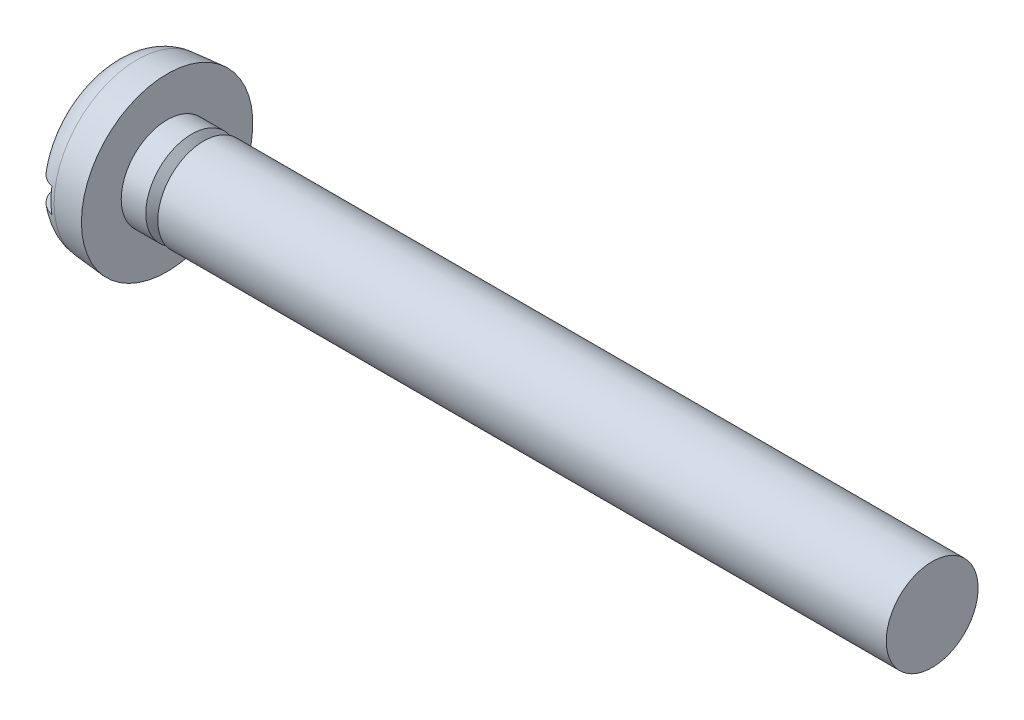
ISO-10303-21;
HEADER;
FILE_DESCRIPTION(('STEP AP214'),'2;1');
FILE_NAME('part.step','',(''),(''),'','','');
FILE_SCHEMA(('AUTOMOTIVE_DESIGN { 1 0 10303 214 1 1 1 1 }'));
ENDSEC;
DATA;
#1=APPLICATION_CONTEXT('core data for automotive mechanical design processes');
#2=APPLICATION_PROTOCOL_DEFINITION('international standard','automotive_design',2000,#1);
#3=PRODUCT_CONTEXT('',#1,'mechanical');
#4=PRODUCT('Part','Part','',(#3));
#5=PRODUCT_RELATED_PRODUCT_CATEGORY('part','',(#4));
#6=PRODUCT_DEFINITION_FORMATION('','',#4);
#7=PRODUCT_DEFINITION_CONTEXT('part definition',#1,'design');
#8=PRODUCT_DEFINITION('design','',#6,#7);
#9=PRODUCT_DEFINITION_SHAPE('','',#8);
#10=(LENGTH_UNIT() NAMED_UNIT(*) SI_UNIT(.MILLI.,.METRE.));
#11=(NAMED_UNIT(*) PLANE_ANGLE_UNIT() SI_UNIT($,.RADIAN.));
#12=(NAMED_UNIT(*) SI_UNIT($,.STERADIAN.) SOLID_ANGLE_UNIT());
#13=UNCERTAINTY_MEASURE_WITH_UNIT(LENGTH_MEASURE(1.E-05),#10,'distance_accuracy_value','');
#14=(GEOMETRIC_REPRESENTATION_CONTEXT(3) GLOBAL_UNCERTAINTY_ASSIGNED_CONTEXT((#13)) GLOBAL_UNIT_ASSIGNED_CONTEXT((#10,
#11,#12)) REPRESENTATION_CONTEXT('',''));
#15=CARTESIAN_POINT('',(0.,0.,0.));
#16=DIRECTION('',(0.,0.,1.));
#17=DIRECTION('',(1.,0.,0.));
#18=AXIS2_PLACEMENT_3D('',#15,#16,#17);
#19=CARTESIAN_POINT('',(0.,0.,0.));
#20=DIRECTION('',(-1.,0.,0.));
#21=DIRECTION('',(0.,0.,1.));
#22=AXIS2_PLACEMENT_3D('',#19,#20,#21);
#23=PLANE('',#22);
#24=DIRECTION('',(0.,0.,-1.));
#25=VECTOR('',#24,1.);
#26=CARTESIAN_POINT('',(0.,0.399999999999999,2.8));
#27=LINE('',#26,#25);
#28=CARTESIAN_POINT('',(0.,0.399999999999999,1.77326763142532));
#29=VERTEX_POINT('',#28);
#30=CARTESIAN_POINT('',(0.,0.399999999999999,-1.77326763142532));
#31=VERTEX_POINT('',#30);
#32=EDGE_CURVE('E85',#29,#31,#27,.T.);
#33=ORIENTED_EDGE('',*,*,#32,.F.);
#34=CARTESIAN_POINT('',(0.,0.,0.));
#35=DIRECTION('',(-1.,0.,0.));
#36=DIRECTION('',(0.,0.,1.));
#37=AXIS2_PLACEMENT_3D('',#34,#35,#36);
#38=CIRCLE('',#37,1.81782234903766);
#39=EDGE_CURVE('E91',#29,#31,#38,.T.);
#40=ORIENTED_EDGE('',*,*,#39,.T.);
#41=EDGE_LOOP('',(#33,#40));
#42=FACE_BOUND('',#41,.T.);
#43=ADVANCED_FACE('F32',(#42),#23,.T.);
#44=CARTESIAN_POINT('',(-25.4,0.,0.));
#45=DIRECTION('',(-1.,0.,0.));
#46=DIRECTION('',(0.,0.,1.));
#47=AXIS2_PLACEMENT_3D('',#44,#45,#46);
#48=CYLINDRICAL_SURFACE('',#47,1.5);
#49=CARTESIAN_POINT('',(2.60359178553217,0.,0.));
#50=DIRECTION('',(-1.,0.,0.));
#51=DIRECTION('',(0.,-1.,0.));
#52=AXIS2_PLACEMENT_3D('',#49,#50,#51);
#53=CIRCLE('',#52,1.5);
#54=CARTESIAN_POINT('',(2.60359178553217,-1.5,0.));
#55=VERTEX_POINT('',#54);
#56=EDGE_CURVE('E163',#55,#55,#53,.T.);
#57=ORIENTED_EDGE('',*,*,#56,.T.);
#58=EDGE_LOOP('',(#57));
#59=FACE_BOUND('',#58,.T.);
#60=CARTESIAN_POINT('',(1.8,0.,0.));
#61=DIRECTION('',(-1.,0.,0.));
#62=DIRECTION('',(0.,0.,1.));
#63=AXIS2_PLACEMENT_3D('',#60,#61,#62);
#64=CIRCLE('',#63,1.5);
#65=CARTESIAN_POINT('',(1.8,0.,1.5));
#66=VERTEX_POINT('',#65);
#67=EDGE_CURVE('E171',#66,#66,#64,.T.);
#68=ORIENTED_EDGE('',*,*,#67,.F.);
#69=EDGE_LOOP('',(#68));
#70=FACE_BOUND('',#69,.T.);
#71=ADVANCED_FACE('F136',(#59,#70),#48,.T.);
#72=DIRECTION('',(0.,0.,1.));
#73=VECTOR('',#72,1.);
#74=CARTESIAN_POINT('',(0.,-0.4,-2.8));
#75=LINE('',#74,#73);
#76=CARTESIAN_POINT('',(0.,-0.4,-1.77326763142532));
#77=VERTEX_POINT('',#76);
#78=CARTESIAN_POINT('',(0.,-0.4,1.77326763142532));
#79=VERTEX_POINT('',#78);
#80=EDGE_CURVE('E76',#77,#79,#75,.T.);
#81=ORIENTED_EDGE('',*,*,#80,.F.);
#82=EDGE_CURVE('E83',#77,#79,#38,.T.);
#83=ORIENTED_EDGE('',*,*,#82,.T.);
#84=EDGE_LOOP('',(#81,#83));
#85=FACE_BOUND('',#84,.T.);
#86=ADVANCED_FACE('F82',(#85),#23,.T.);
#87=CARTESIAN_POINT('',(0.,0.,0.));
#88=DIRECTION('',(1.,0.,0.));
#89=DIRECTION('',(0.,0.,-1.));
#90=AXIS2_PLACEMENT_3D('',#87,#88,#89);
#91=CONICAL_SURFACE('',#90,2.64252040565334,0.087266462599717);
#92=CARTESIAN_POINT('',(0.821559831527107,0.,0.));
#93=DIRECTION('',(-1.,0.,0.));
#94=DIRECTION('',(0.,0.,1.));
#95=AXIS2_PLACEMENT_3D('',#92,#93,#94);
#96=CIRCLE('',#95,2.71439757732023);
#97=CARTESIAN_POINT('',(0.821559831527107,0.,2.71439757732023));
#98=VERTEX_POINT('',#97);
#99=EDGE_CURVE('E95',#98,#98,#96,.F.);
#100=ORIENTED_EDGE('',*,*,#99,.T.);
#101=EDGE_LOOP('',(#100));
#102=FACE_BOUND('',#101,.T.);
#103=CARTESIAN_POINT('',(1.8,0.,0.));
#104=DIRECTION('',(-1.,0.,0.));
#105=DIRECTION('',(0.,0.,1.));
#106=AXIS2_PLACEMENT_3D('',#103,#104,#105);
#107=CIRCLE('',#106,2.8);
#108=CARTESIAN_POINT('',(1.8,0.,2.8));
#109=VERTEX_POINT('',#108);
#110=EDGE_CURVE('E97',#109,#109,#107,.T.);
#111=ORIENTED_EDGE('',*,*,#110,.T.);
#112=EDGE_LOOP('',(#111));
#113=FACE_BOUND('',#112,.T.);
#114=ADVANCED_FACE('F129',(#102,#113),#91,.T.);
#115=CARTESIAN_POINT('',(1.8,1.5,0.));
#116=DIRECTION('',(-1.,0.,0.));
#117=DIRECTION('',(0.,0.,1.));
#118=AXIS2_PLACEMENT_3D('',#115,#116,#117);
#119=PLANE('',#118);
#120=ORIENTED_EDGE('',*,*,#110,.F.);
#121=EDGE_LOOP('',(#120));
#122=FACE_BOUND('',#121,.T.);
#123=ORIENTED_EDGE('',*,*,#67,.T.);
#124=EDGE_LOOP('',(#123));
#125=FACE_BOUND('',#124,.T.);
#126=ADVANCED_FACE('F125',(#122,#125),#119,.F.);
#127=CARTESIAN_POINT('',(0.9,0.,0.));
#128=DIRECTION('',(-1.,0.,0.));
#129=DIRECTION('',(0.,0.,1.));
#130=AXIS2_PLACEMENT_3D('',#127,#128,#129);
#131=TOROIDAL_SURFACE('',#130,1.81782234903766,0.9);
#132=CARTESIAN_POINT('',(0.285780762477817,0.399999999999999,-2.44311963508101));
#133=CARTESIAN_POINT('',(0.322325244969282,0.399999999999999,-2.47769297217772));
#134=CARTESIAN_POINT('',(0.361794878156767,0.399999999999999,-2.50922544126929));
#135=CARTESIAN_POINT('',(0.445493757535042,0.399999999999999,-2.56525291577746));
#136=CARTESIAN_POINT('',(0.48972822484029,0.399999999999999,-2.58974009118149));
#137=CARTESIAN_POINT('',(0.581685294636184,0.399999999999999,-2.63091846199156));
#138=CARTESIAN_POINT('',(0.629407305379897,0.399999999999999,-2.64761097641683));
#139=CARTESIAN_POINT('',(0.726972312257168,0.399999999999999,-2.67270033258514));
#140=CARTESIAN_POINT('',(0.776814803129367,0.399999999999999,-2.68109913910669));
#141=CARTESIAN_POINT('',(0.876977038697278,0.399999999999999,-2.68933922206438));
#142=CARTESIAN_POINT('',(0.92729364560996,0.399999999999999,-2.68921866149007));
#143=CARTESIAN_POINT('',(1.02719093347253,0.399999999999999,-2.68051830929739));
#144=CARTESIAN_POINT('',(1.07677160162593,0.399999999999999,-2.67193837076201));
#145=CARTESIAN_POINT('',(1.17371760664879,0.399999999999999,-2.6465919807109));
#146=CARTESIAN_POINT('',(1.2210859954371,0.399999999999999,-2.62983719558013));
#147=CARTESIAN_POINT('',(1.31235127069059,0.399999999999999,-2.58864040768255));
#148=CARTESIAN_POINT('',(1.35624813968071,0.399999999999999,-2.56419836622246));
#149=CARTESIAN_POINT('',(1.43950339303332,0.399999999999999,-2.50824069345436));
#150=CARTESIAN_POINT('',(1.47884484993389,0.399999999999999,-2.47669988555644));
#151=CARTESIAN_POINT('',(1.55173067508121,0.399999999999999,-2.40751412200212));
#152=CARTESIAN_POINT('',(1.5852748745774,0.399999999999999,-2.36986898871862));
#153=CARTESIAN_POINT('',(1.64594872274809,0.399999999999999,-2.28919528368316));
#154=CARTESIAN_POINT('',(1.67301846569636,0.399999999999999,-2.24612167422176));
#155=CARTESIAN_POINT('',(1.71966197411636,0.399999999999999,-2.15609376898817));
#156=CARTESIAN_POINT('',(1.73923530584546,0.399999999999999,-2.10913924885738));
#157=CARTESIAN_POINT('',(1.77066025907209,0.399999999999999,-2.01194193646076));
#158=CARTESIAN_POINT('',(1.78239254664628,0.399999999999999,-1.96166058810882));
#159=CARTESIAN_POINT('',(1.7974373595853,0.399999999999999,-1.85985639013623));
#160=CARTESIAN_POINT('',(1.80074908437145,0.399999999999999,-1.80833342293966));
#161=CARTESIAN_POINT('',(1.79894832980293,0.399999999999999,-1.70434405475568));
#162=CARTESIAN_POINT('',(1.79365584590562,0.399999999999999,-1.651880798299));
#163=CARTESIAN_POINT('',(1.77456092354076,0.399999999999999,-1.54852841034414));
#164=CARTESIAN_POINT('',(1.76075741543224,0.399999999999999,-1.49763947754675));
#165=CARTESIAN_POINT('',(1.7246504916629,0.399999999999999,-1.3975266769579));
#166=CARTESIAN_POINT('',(1.70214283236717,0.399999999999999,-1.34837644263265));
#167=CARTESIAN_POINT('',(1.64933120824444,0.399999999999999,-1.25444995564252));
#168=CARTESIAN_POINT('',(1.6190255468442,0.399999999999999,-1.20967465773975));
#169=CARTESIAN_POINT('',(1.55085214424215,0.399999999999999,-1.12504927254803));
#170=CARTESIAN_POINT('',(1.51286662510254,0.399999999999999,-1.08529386793689));
#171=CARTESIAN_POINT('',(1.4306134165613,0.399999999999999,-1.01288372669285));
#172=CARTESIAN_POINT('',(1.38634513970435,0.399999999999999,-0.980229654778111));
#173=CARTESIAN_POINT('',(1.29378824575784,0.399999999999999,-0.924048107397016));
#174=CARTESIAN_POINT('',(1.24562231583718,0.399999999999999,-0.900319541839471));
#175=CARTESIAN_POINT('',(1.14574424072186,0.399999999999999,-0.862177327128566));
#176=CARTESIAN_POINT('',(1.09403573066562,0.399999999999999,-0.847754283110135));
#177=CARTESIAN_POINT('',(0.993395643106034,0.399999999999999,-0.830011922353259));
#178=CARTESIAN_POINT('',(0.944615271160062,0.399999999999999,-0.825833796085957));
#179=CARTESIAN_POINT('',(0.847107354416666,0.399999999999999,-0.826334878356685));
#180=CARTESIAN_POINT('',(0.798379798268946,0.399999999999999,-0.831011470142969));
#181=CARTESIAN_POINT('',(0.705495670608723,0.399999999999999,-0.848340731069384));
#182=CARTESIAN_POINT('',(0.661242330843084,0.399999999999999,-0.860484898174224));
#183=CARTESIAN_POINT('',(0.575232402842408,0.399999999999999,-0.891650416332973));
#184=CARTESIAN_POINT('',(0.53347652813922,0.399999999999999,-0.910673721938904));
#185=CARTESIAN_POINT('',(0.451191926076945,0.399999999999999,-0.956010770911779));
#186=CARTESIAN_POINT('',(0.410848958567061,0.399999999999999,-0.982660648611481));
#187=CARTESIAN_POINT('',(0.334722321142852,0.399999999999999,-1.04182188589593));
#188=CARTESIAN_POINT('',(0.298940164912518,0.399999999999999,-1.0743351828853));
#189=CARTESIAN_POINT('',(0.229649980616187,0.399999999999999,-1.14749226888793));
#190=CARTESIAN_POINT('',(0.19663491483028,0.399999999999999,-1.18860403936715));
#191=CARTESIAN_POINT('',(0.137645150810003,0.399999999999999,-1.27560624817727));
#192=CARTESIAN_POINT('',(0.111672172806046,0.399999999999999,-1.32149785033543));
#193=CARTESIAN_POINT('',(0.0665593590158845,0.399999999999999,-1.41881690272049));
#194=CARTESIAN_POINT('',(0.0477401615322295,0.399999999999999,-1.47039354331754));
#195=CARTESIAN_POINT('',(0.0191028447664949,0.399999999999999,-1.57598967955257));
#196=CARTESIAN_POINT('',(0.0092842991143383,0.399999999999999,-1.63000905934828));
#197=CARTESIAN_POINT('',(-0.000908845669418229,0.399999999999999,-1.73850050809585));
#198=CARTESIAN_POINT('',(-0.00135843890630432,0.399999999999999,-1.7929654882335));
#199=CARTESIAN_POINT('',(0.00713794868793661,0.399999999999999,-1.90117587148683));
#200=CARTESIAN_POINT('',(0.0160852351491477,0.399999999999999,-1.9549211735574));
#201=CARTESIAN_POINT('',(0.0428869469078851,0.399999999999999,-2.05874477252473));
#202=CARTESIAN_POINT('',(0.0605196216319729,0.399999999999999,-2.10888044427302));
#203=CARTESIAN_POINT('',(0.104140493725079,0.399999999999999,-2.20532358851202));
#204=CARTESIAN_POINT('',(0.130117020588857,0.399999999999999,-2.25163629510255));
#205=CARTESIAN_POINT('',(0.178150945787741,0.399999999999999,-2.32211375046635));
#206=CARTESIAN_POINT('',(0.197843641859489,0.399999999999999,-2.34792122195273));
#207=CARTESIAN_POINT('',(0.239879292580621,0.399999999999999,-2.39728022756983));
#208=CARTESIAN_POINT('',(0.26222221206527,0.399999999999999,-2.42083179162577));
#209=CARTESIAN_POINT('',(0.285780762477817,0.399999999999999,-2.44311963508101));
#210=B_SPLINE_CURVE_WITH_KNOTS('',3,(#132,#133,#134,#135,#136,#137,#138,#139,#140,#141,#142,
#143,#144,#145,#146,#147,#148,#149,#150,#151,#152,#153,#154,#155,#156,#157,#158,#159,#160,#161,
#162,#163,#164,#165,#166,#167,#168,#169,#170,#171,#172,#173,#174,#175,#176,#177,#178,#179,#180,
#181,#182,#183,#184,#185,#186,#187,#188,#189,#190,#191,#192,#193,#194,#195,#196,#197,#198,#199,
#200,#201,#202,#203,#204,#205,#206,#207,#208,#209),.UNSPECIFIED.,.T.,.F.,(4,2,2,2,2,2,2,2,2,2,2,
2,2,2,2,2,2,2,2,2,2,2,2,2,2,2,2,2,2,2,2,2,2,2,2,2,2,2,4),(0.,0.15080428220943,0.301775523831159,
0.452721208703323,0.603631125974155,0.753865076726384,0.904101636690626,1.05412441728995,
1.2041479530309,1.35471219197995,1.50528081291863,1.65719291262943,1.80911380065295,
1.96329712022902,2.11749509812026,2.27496068670365,2.43244606914274,2.59387611122166,
2.75534130458713,2.9195015653164,3.08367718561128,3.24389389244898,3.40394859014677,
3.55004213794101,3.69609251881818,3.83315592967566,3.97025831464733,4.11470991133513,
4.25920932580005,4.41668805635775,4.57420522099047,4.73812462607052,4.90203626571949,
5.06463536051201,5.22725705028985,5.38592661841767,5.54437521558828,5.64159310397338,
5.73880970255809),.UNSPECIFIED.);
#211=CARTESIAN_POINT('',(0.7,0.399999999999999,-2.66547244738019));
#212=VERTEX_POINT('',#211);
#213=EDGE_CURVE('E11',#31,#212,#210,.T.);
#214=ORIENTED_EDGE('',*,*,#213,.F.);
#215=ORIENTED_EDGE('',*,*,#39,.F.);
#216=CARTESIAN_POINT('',(0.356169071138296,0.399999999999999,1.02545886384317));
#217=CARTESIAN_POINT('',(0.394477383289829,0.399999999999999,0.994276095963573));
#218=CARTESIAN_POINT('',(0.435252098816795,0.399999999999999,0.966090537778846));
#219=CARTESIAN_POINT('',(0.520874070068605,0.399999999999999,0.916713010685472));
#220=CARTESIAN_POINT('',(0.56572297498939,0.399999999999999,0.895523890103122));
#221=CARTESIAN_POINT('',(0.658585145836014,0.399999999999999,0.861072215462475));
#222=CARTESIAN_POINT('',(0.706609437889925,0.399999999999999,0.84783908573147));
#223=CARTESIAN_POINT('',(0.80424325350734,0.399999999999999,0.83024223356215));
#224=CARTESIAN_POINT('',(0.853851628876229,0.399999999999999,0.825872228699233));
#225=CARTESIAN_POINT('',(0.950010182321422,0.399999999999999,0.826277197704913));
#226=CARTESIAN_POINT('',(0.99656347412262,0.399999999999999,0.830513937244102));
#227=CARTESIAN_POINT('',(1.08828168676608,0.399999999999999,0.846797595491545));
#228=CARTESIAN_POINT('',(1.1334463088223,0.399999999999999,0.858846182848628));
#229=CARTESIAN_POINT('',(1.22099947575276,0.399999999999999,0.890027753500388));
#230=CARTESIAN_POINT('',(1.26339999097867,0.399999999999999,0.909127417221132));
#231=CARTESIAN_POINT('',(1.34475562295769,0.399999999999999,0.953613660794996));
#232=CARTESIAN_POINT('',(1.38370973618203,0.399999999999999,0.979002063689565));
#233=CARTESIAN_POINT('',(1.4606297229717,0.399999999999999,1.03768873851847));
#234=CARTESIAN_POINT('',(1.49821861120609,0.399999999999999,1.07148126912978));
#235=CARTESIAN_POINT('',(1.56766557552966,0.399999999999999,1.14451739265722));
#236=CARTESIAN_POINT('',(1.59952174981566,0.399999999999999,1.18376278691406));
#237=CARTESIAN_POINT('',(1.65882951195037,0.399999999999999,1.26965174466254));
#238=CARTESIAN_POINT('',(1.68580874421987,0.399999999999999,1.3166225459502));
#239=CARTESIAN_POINT('',(1.7316261790846,0.399999999999999,1.41438438512647));
#240=CARTESIAN_POINT('',(1.7504634598458,0.399999999999999,1.46517585482832));
#241=CARTESIAN_POINT('',(1.77959171793735,0.399999999999999,1.56990546726));
#242=CARTESIAN_POINT('',(1.78976336496765,0.399999999999999,1.62387693551388));
#243=CARTESIAN_POINT('',(1.80070617985939,0.399999999999999,1.73276786407042));
#244=CARTESIAN_POINT('',(1.80147810121521,0.399999999999999,1.78768724803349));
#245=CARTESIAN_POINT('',(1.7935515731225,0.399999999999999,1.89576039323533));
#246=CARTESIAN_POINT('',(1.78503812714098,0.399999999999999,1.94892767588158));
#247=CARTESIAN_POINT('',(1.75897009134329,0.399999999999999,2.05299963181349));
#248=CARTESIAN_POINT('',(1.74141670948687,0.399999999999999,2.10390460641263));
#249=CARTESIAN_POINT('',(1.69825810143573,0.399999999999999,2.20064023444731));
#250=CARTESIAN_POINT('',(1.67286703477487,0.399999999999999,2.24656646381803));
#251=CARTESIAN_POINT('',(1.61458416704904,0.399999999999999,2.33338474929434));
#252=CARTESIAN_POINT('',(1.58169323312494,0.399999999999999,2.37427738654701));
#253=CARTESIAN_POINT('',(1.51007060998367,0.399999999999999,2.44900649357427));
#254=CARTESIAN_POINT('',(1.47146964140907,0.399999999999999,2.48296829636122));
#255=CARTESIAN_POINT('',(1.38904817001727,0.399999999999999,2.54382334084698));
#256=CARTESIAN_POINT('',(1.34522808158393,0.399999999999999,2.57071714318276));
#257=CARTESIAN_POINT('',(1.25424836231413,0.399999999999999,2.61630908807752));
#258=CARTESIAN_POINT('',(1.20714119293126,0.399999999999999,2.63511196373395));
#259=CARTESIAN_POINT('',(1.11042474691739,0.399999999999999,2.66447616047847));
#260=CARTESIAN_POINT('',(1.06081558875378,0.399999999999999,2.67503787139057));
#261=CARTESIAN_POINT('',(0.960893961973373,0.399999999999999,2.68755622717405));
#262=CARTESIAN_POINT('',(0.910589316471373,0.399999999999999,2.68957539390776));
#263=CARTESIAN_POINT('',(0.810358152757913,0.399999999999999,2.68512046084422));
#264=CARTESIAN_POINT('',(0.760431626986743,0.399999999999999,2.67864653130185));
#265=CARTESIAN_POINT('',(0.662478823238217,0.399999999999999,2.65741995217084));
#266=CARTESIAN_POINT('',(0.614448868329621,0.399999999999999,2.64268425826029));
#267=CARTESIAN_POINT('',(0.521534433162197,0.399999999999999,2.60538142887937));
#268=CARTESIAN_POINT('',(0.476649962619439,0.399999999999999,2.58281426921971));
#269=CARTESIAN_POINT('',(0.391148993047609,0.399999999999999,2.53043182461717));
#270=CARTESIAN_POINT('',(0.350545548527357,0.399999999999999,2.50059523892845));
#271=CARTESIAN_POINT('',(0.27487411765014,0.399999999999999,2.43457977439371));
#272=CARTESIAN_POINT('',(0.239806285839746,0.399999999999999,2.39840071853429));
#273=CARTESIAN_POINT('',(0.1758792791862,0.399999999999999,2.32042102737606));
#274=CARTESIAN_POINT('',(0.147073507775005,0.399999999999999,2.27857662814835));
#275=CARTESIAN_POINT('',(0.0967847753411475,0.399999999999999,2.19069995841567));
#276=CARTESIAN_POINT('',(0.07530224160311,0.399999999999999,2.14466744374764));
#277=CARTESIAN_POINT('',(0.0399276675747797,0.399999999999999,2.04903409979779));
#278=CARTESIAN_POINT('',(0.0261471165350435,0.399999999999999,1.99939205575588));
#279=CARTESIAN_POINT('',(0.00693602242391587,0.399999999999999,1.89852251200784));
#280=CARTESIAN_POINT('',(0.00150590448368245,0.399999999999999,1.84729493171548));
#281=CARTESIAN_POINT('',(-0.000985777473936844,0.399999999999999,1.74359522844075));
#282=CARTESIAN_POINT('',(0.00212519999965288,0.399999999999999,1.69111899279254));
#283=CARTESIAN_POINT('',(0.0168916821616579,0.399999999999999,1.58737297380086));
#284=CARTESIAN_POINT('',(0.0285499964789277,0.399999999999999,1.53610359288829));
#285=CARTESIAN_POINT('',(0.0604020950384819,0.399999999999999,1.43486374575567));
#286=CARTESIAN_POINT('',(0.080804315905155,0.399999999999999,1.38495893538538));
#287=CARTESIAN_POINT('',(0.129530825890043,0.399999999999999,1.28921347783136));
#288=CARTESIAN_POINT('',(0.157849403934622,0.399999999999999,1.24336993202389));
#289=CARTESIAN_POINT('',(0.213684916145749,0.399999999999999,1.16773658539622));
#290=CARTESIAN_POINT('',(0.239651023875377,0.399999999999999,1.13678903007943));
#291=CARTESIAN_POINT('',(0.29525297901351,0.399999999999999,1.07838116842152));
#292=CARTESIAN_POINT('',(0.324888803246328,0.399999999999999,1.05092084005941));
#293=CARTESIAN_POINT('',(0.356169071138296,0.399999999999999,1.02545886384317));
#294=B_SPLINE_CURVE_WITH_KNOTS('',3,(#216,#217,#218,#219,#220,#221,#222,#223,#224,#225,#226,
#227,#228,#229,#230,#231,#232,#233,#234,#235,#236,#237,#238,#239,#240,#241,#242,#243,#244,#245,
#246,#247,#248,#249,#250,#251,#252,#253,#254,#255,#256,#257,#258,#259,#260,#261,#262,#263,#264,
#265,#266,#267,#268,#269,#270,#271,#272,#273,#274,#275,#276,#277,#278,#279,#280,#281,#282,#283,
#284,#285,#286,#287,#288,#289,#290,#291,#292,#293),.UNSPECIFIED.,.T.,.F.,(4,2,2,2,2,2,2,2,2,2,2,
2,2,2,2,2,2,2,2,2,2,2,2,2,2,2,2,2,2,2,2,2,2,2,2,2,2,2,4),(0.,0.148056677712979,
0.296173556814866,0.444834912477076,0.593390856036848,0.732942639414739,0.87252424155987,
1.01145452751666,1.15042513517956,1.30141738715291,1.45245963818336,1.61420969223844,
1.7759780548859,1.93993961693164,2.10388803551639,2.26462860972824,2.42534771058163,
2.58201478455569,2.73866375372932,2.89216335268838,3.04565077231286,3.19708679229202,
3.34851564860216,3.49883427697698,3.64914989207022,3.79915813668078,3.94916684463061,
4.09962050651671,4.25007836811616,4.40177296660437,4.55347641441351,4.70732244078731,
4.86117629939849,5.0181609530014,5.17519723279955,5.33620557401864,5.49709805791682,
5.61799301592463,5.73888721047272),.UNSPECIFIED.);
#295=CARTESIAN_POINT('',(0.7,0.399999999999999,2.66547244738019));
#296=VERTEX_POINT('',#295);
#297=EDGE_CURVE('E109',#296,#29,#294,.T.);
#298=ORIENTED_EDGE('',*,*,#297,.F.);
#299=CARTESIAN_POINT('',(0.7,0.,0.));
#300=DIRECTION('',(-1.,0.,0.));
#301=DIRECTION('',(0.,0.,1.));
#302=AXIS2_PLACEMENT_3D('',#299,#300,#301);
#303=CIRCLE('',#302,2.69531878777687);
#304=CARTESIAN_POINT('',(0.7,-0.4,2.66547244738019));
#305=VERTEX_POINT('',#304);
#306=EDGE_CURVE('E103',#296,#305,#303,.F.);
#307=ORIENTED_EDGE('',*,*,#306,.T.);
#308=CARTESIAN_POINT('',(0.356169071138295,-0.4,1.02545886384317));
#309=CARTESIAN_POINT('',(0.314031332279046,-0.4,1.05976167261355));
#310=CARTESIAN_POINT('',(0.274819372687131,-0.4,1.0977427449374));
#311=CARTESIAN_POINT('',(0.20326819432942,-0.4,1.17978565669674));
#312=CARTESIAN_POINT('',(0.170942545508555,-0.4,1.22385922524595));
#313=CARTESIAN_POINT('',(0.114111407238762,-0.4,1.31672727393884));
#314=CARTESIAN_POINT('',(0.0895968760226379,-0.4,1.36551620987613));
#315=CARTESIAN_POINT('',(0.0490785202121342,-0.4,1.46648183341045));
#316=CARTESIAN_POINT('',(0.0330703604686471,-0.4,1.51865678013273));
#317=CARTESIAN_POINT('',(0.0100453697545739,-0.4,1.62518908376032));
#318=CARTESIAN_POINT('',(0.00306618218707072,-0.4,1.67955460937645));
#319=CARTESIAN_POINT('',(-0.00144685561490153,-0.4,1.78868546318226));
#320=CARTESIAN_POINT('',(0.00101939609011318,-0.4,1.84345079568049));
#321=CARTESIAN_POINT('',(0.0152891480749748,-0.4,1.95052330416009));
#322=CARTESIAN_POINT('',(0.0268854930795697,-0.4,2.0028580557661));
#323=CARTESIAN_POINT('',(0.0589248901673074,-0.4,2.10474672243029));
#324=CARTESIAN_POINT('',(0.0793666318053631,-0.4,2.15430104818042));
#325=CARTESIAN_POINT('',(0.12795627217374,-0.4,2.24792186385266));
#326=CARTESIAN_POINT('',(0.155901237504733,-0.4,2.29209371256844));
#327=CARTESIAN_POINT('',(0.218944857951456,-0.4,2.37499861286517));
#328=CARTESIAN_POINT('',(0.254042725445854,-0.4,2.41373226246544));
#329=CARTESIAN_POINT('',(0.32966685096813,-0.4,2.48389534278566));
#330=CARTESIAN_POINT('',(0.370077637452012,-0.4,2.51544927894014));
#331=CARTESIAN_POINT('',(0.455677448683675,-0.4,2.57122459505542));
#332=CARTESIAN_POINT('',(0.500866128165061,-0.4,2.59544650436481));
#333=CARTESIAN_POINT('',(0.59413782417454,-0.4,2.6355729416184));
#334=CARTESIAN_POINT('',(0.642178527071038,-0.4,2.65157587103637));
#335=CARTESIAN_POINT('',(0.740273420359947,-0.4,2.67523109383666));
#336=CARTESIAN_POINT('',(0.790327524333046,-0.4,2.68288374523438));
#337=CARTESIAN_POINT('',(0.890686133385994,-0.4,2.68958762962226));
#338=CARTESIAN_POINT('',(0.940986998851127,-0.4,2.68869347246838));
#339=CARTESIAN_POINT('',(1.04072178380744,-0.4,2.67846167879018));
#340=CARTESIAN_POINT('',(1.0901557170213,-0.4,2.66912417603886));
#341=CARTESIAN_POINT('',(1.18669599164727,-0.4,2.64229877559468));
#342=CARTESIAN_POINT('',(1.23380501833184,-0.4,2.6248205362643));
#343=CARTESIAN_POINT('',(1.32443528846507,-0.4,2.58223220159563));
#344=CARTESIAN_POINT('',(1.36795650500275,-0.4,2.5571220490195));
#345=CARTESIAN_POINT('',(1.45036421793263,-0.4,2.49989362614525));
#346=CARTESIAN_POINT('',(1.48923230512215,-0.4,2.46774885590998));
#347=CARTESIAN_POINT('',(1.56107927302393,-0.4,2.39744378923729));
#348=CARTESIAN_POINT('',(1.59405796507024,-0.4,2.35928330016087));
#349=CARTESIAN_POINT('',(1.65352847250663,-0.4,2.2776666814067));
#350=CARTESIAN_POINT('',(1.67995797143492,-0.4,2.23416516156708));
#351=CARTESIAN_POINT('',(1.72526137908633,-0.4,2.14339421504174));
#352=CARTESIAN_POINT('',(1.74413484906926,-0.4,2.09612456975119));
#353=CARTESIAN_POINT('',(1.77411508290512,-0.4,1.9983989612356));
#354=CARTESIAN_POINT('',(1.78509960932637,-0.4,1.9479055243096));
#355=CARTESIAN_POINT('',(1.79862667184961,-0.4,1.84580292273346));
#356=CARTESIAN_POINT('',(1.80116838107033,-0.4,1.79419364929756));
#357=CARTESIAN_POINT('',(1.79780993826834,-0.4,1.69014314952536));
#358=CARTESIAN_POINT('',(1.79172746900389,-0.4,1.63770783465182));
#359=CARTESIAN_POINT('',(1.77106806778027,-0.4,1.53454005861514));
#360=CARTESIAN_POINT('',(1.75649007103968,-0.4,1.48380781174802));
#361=CARTESIAN_POINT('',(1.7188487103298,-0.4,1.38413781596447));
#362=CARTESIAN_POINT('',(1.69558194660123,-0.4,1.33527684770509));
#363=CARTESIAN_POINT('',(1.64130257902653,-0.4,1.24205401456033));
#364=CARTESIAN_POINT('',(1.6102882125599,-0.4,1.19769317671197));
#365=CARTESIAN_POINT('',(1.54078360718032,-0.4,1.11407031283595));
#366=CARTESIAN_POINT('',(1.50218355419827,-0.4,1.07489936013486));
#367=CARTESIAN_POINT('',(1.418793823597,-0.4,1.00377929202409));
#368=CARTESIAN_POINT('',(1.37400377230517,-0.4,0.971830612909673));
#369=CARTESIAN_POINT('',(1.28066227969846,-0.4,0.917245549760186));
#370=CARTESIAN_POINT('',(1.23224470963451,-0.4,0.894381439836963));
#371=CARTESIAN_POINT('',(1.13202516716603,-0.4,0.858023892867301));
#372=CARTESIAN_POINT('',(1.08022692076976,-0.4,0.844520323748755));
#373=CARTESIAN_POINT('',(0.979686768939645,-0.4,0.828554710074538));
#374=CARTESIAN_POINT('',(0.93108358272059,-0.4,0.82521631591368));
#375=CARTESIAN_POINT('',(0.834057576527117,-0.4,0.827306267768066));
#376=CARTESIAN_POINT('',(0.785634764475607,-0.4,0.832734994430688));
#377=CARTESIAN_POINT('',(0.693219129123407,-0.4,0.851440182721389));
#378=CARTESIAN_POINT('',(0.6491307615266,-0.4,0.864254528165209));
#379=CARTESIAN_POINT('',(0.563580966367806,-0.4,0.896690334746237));
#380=CARTESIAN_POINT('',(0.522117110679347,-0.4,0.916305391888431));
#381=CARTESIAN_POINT('',(0.460201335026828,-0.4,0.951554535089635));
#382=CARTESIAN_POINT('',(0.438547037771903,-0.4,0.965129512636783));
#383=CARTESIAN_POINT('',(0.396436028831445,-0.4,0.994018383793285));
#384=CARTESIAN_POINT('',(0.375979221006585,-0.4,1.00933213751563));
#385=CARTESIAN_POINT('',(0.356169071138295,-0.4,1.02545886384317));
#386=B_SPLINE_CURVE_WITH_KNOTS('',3,(#308,#309,#310,#311,#312,#313,#314,#315,#316,#317,#318,
#319,#320,#321,#322,#323,#324,#325,#326,#327,#328,#329,#330,#331,#332,#333,#334,#335,#336,#337,
#338,#339,#340,#341,#342,#343,#344,#345,#346,#347,#348,#349,#350,#351,#352,#353,#354,#355,#356,
#357,#358,#359,#360,#361,#362,#363,#364,#365,#366,#367,#368,#369,#370,#371,#372,#373,#374,#375,
#376,#377,#378,#379,#380,#381,#382,#383,#384,#385),.UNSPECIFIED.,.T.,.F.,(4,2,2,2,2,2,2,2,2,2,2,
2,2,2,2,2,2,2,2,2,2,2,2,2,2,2,2,2,2,2,2,2,2,2,2,2,2,2,4),(0.,0.162908543977831,
0.326135200101453,0.489172220791498,0.652126072139756,0.815757140806174,0.979389975458609,
1.13941349616251,1.29941331750199,1.45545894016543,1.61148738958683,1.76455910424509,
1.91761976498379,2.068802492645,2.21997873814259,2.37018969158947,2.52039826519579,
2.67042907998157,2.82046101999671,2.97106818075077,3.12168016531919,3.27367450756494,
3.42567767407005,3.5799880622519,3.73431356299688,3.89195060675763,4.04960741210517,
4.2112132976058,4.37285598283535,4.53703863620331,4.70123120514445,4.86099956435944,
5.02059471531597,5.16597452097209,5.31136063884072,5.44850857150574,5.58552770590542,
5.66212180496716,5.73870974628516),.UNSPECIFIED.);
#387=EDGE_CURVE('E90',#79,#305,#386,.T.);
#388=ORIENTED_EDGE('',*,*,#387,.F.);
#389=ORIENTED_EDGE('',*,*,#82,.F.);
#390=CARTESIAN_POINT('',(0.285780762477817,-0.4,-2.44311963508101));
#391=CARTESIAN_POINT('',(0.248557143829483,-0.4,-2.4078972812164));
#392=CARTESIAN_POINT('',(0.214312452361191,-0.4,-2.3694650707352));
#393=CARTESIAN_POINT('',(0.152768043532584,-0.4,-2.28733938194963));
#394=CARTESIAN_POINT('',(0.125478130377416,-0.4,-2.24363860286105));
#395=CARTESIAN_POINT('',(0.0786257158649477,-0.4,-2.15234079857027));
#396=CARTESIAN_POINT('',(0.0590537929026405,-0.4,-2.10474861000723));
#397=CARTESIAN_POINT('',(0.0280650821156157,-0.4,-2.00700047851119));
#398=CARTESIAN_POINT('',(0.0166461813020744,-0.4,-1.95684520345737));
#399=CARTESIAN_POINT('',(0.00206923204411929,-0.4,-1.85464080389292));
#400=CARTESIAN_POINT('',(-0.000972085111053079,-0.4,-1.80257506295451));
#401=CARTESIAN_POINT('',(0.00151453147792944,-0.4,-1.69864852440772));
#402=CARTESIAN_POINT('',(0.00704382880236603,-0.4,-1.64678776072725));
#403=CARTESIAN_POINT('',(0.0266516864050343,-0.4,-1.5434240201059));
#404=CARTESIAN_POINT('',(0.0409314131746847,-0.4,-1.49195921679783));
#405=CARTESIAN_POINT('',(0.0777275151672631,-0.4,-1.39206285915813));
#406=CARTESIAN_POINT('',(0.100245079836245,-0.4,-1.34363174403842));
#407=CARTESIAN_POINT('',(0.153482972183088,-0.4,-1.2500005252344));
#408=CARTESIAN_POINT('',(0.184382352554497,-0.4,-1.20490211419648));
#409=CARTESIAN_POINT('',(0.253306595403158,-0.4,-1.12049761259773));
#410=CARTESIAN_POINT('',(0.29133345875337,-0.4,-1.08119315410127));
#411=CARTESIAN_POINT('',(0.373599819825438,-0.4,-1.00962170698056));
#412=CARTESIAN_POINT('',(0.417845144124488,-0.4,-0.977361391817104));
#413=CARTESIAN_POINT('',(0.511393224424661,-0.4,-0.921257408160295));
#414=CARTESIAN_POINT('',(0.560693424544354,-0.4,-0.897409512943095));
#415=CARTESIAN_POINT('',(0.659899494014214,-0.4,-0.86056620148907));
#416=CARTESIAN_POINT('',(0.709596655508471,-0.4,-0.847011806093055));
#417=CARTESIAN_POINT('',(0.81063175641273,-0.4,-0.829407026781007));
#418=CARTESIAN_POINT('',(0.861968199741099,-0.4,-0.825348214635539));
#419=CARTESIAN_POINT('',(0.959752077480287,-0.4,-0.82693832731787));
#420=CARTESIAN_POINT('',(1.00621575887747,-0.4,-0.831730406017744));
#421=CARTESIAN_POINT('',(1.09766854953413,-0.4,-0.849077179323799));
#422=CARTESIAN_POINT('',(1.14265739171951,-0.4,-0.861633271803835));
#423=CARTESIAN_POINT('',(1.2299114176728,-0.4,-0.893807868219966));
#424=CARTESIAN_POINT('',(1.27218175788193,-0.4,-0.913412506998421));
#425=CARTESIAN_POINT('',(1.35320643219735,-0.4,-0.958874855551496));
#426=CARTESIAN_POINT('',(1.39195973961517,-0.4,-0.984734383223624));
#427=CARTESIAN_POINT('',(1.46843970297676,-0.4,-1.04440221898529));
#428=CARTESIAN_POINT('',(1.5057776319984,-0.4,-1.07870901508261));
#429=CARTESIAN_POINT('',(1.57463408911242,-0.4,-1.15273784634507));
#430=CARTESIAN_POINT('',(1.60615068897795,-0.4,-1.19246166827117));
#431=CARTESIAN_POINT('',(1.66460952025841,-0.4,-1.27921419766999));
#432=CARTESIAN_POINT('',(1.69108592858502,-0.4,-1.32655784594954));
#433=CARTESIAN_POINT('',(1.73582713929311,-0.4,-1.42498260596115));
#434=CARTESIAN_POINT('',(1.75409110005355,-0.4,-1.47606410012853));
#435=CARTESIAN_POINT('',(1.7819800651308,-0.4,-1.58118959955467));
#436=CARTESIAN_POINT('',(1.79150042969761,-0.4,-1.63526148025197));
#437=CARTESIAN_POINT('',(1.80112725488866,-0.4,-1.74424014808114));
#438=CARTESIAN_POINT('',(1.80123449731023,-0.4,-1.79914686549765));
#439=CARTESIAN_POINT('',(1.79200090917881,-0.4,-1.90704889801334));
#440=CARTESIAN_POINT('',(1.78285023172313,-0.4,-1.96006044029451));
#441=CARTESIAN_POINT('',(1.75554489311913,-0.4,-2.06371351442585));
#442=CARTESIAN_POINT('',(1.73739144905737,-0.4,-2.11435536562276));
#443=CARTESIAN_POINT('',(1.69310212999213,-0.4,-2.21047686976185));
#444=CARTESIAN_POINT('',(1.66717834059447,-0.4,-2.25605427430112));
#445=CARTESIAN_POINT('',(1.60789945686383,-0.4,-2.34209023989538));
#446=CARTESIAN_POINT('',(1.57454519739076,-0.4,-2.38254937521993));
#447=CARTESIAN_POINT('',(1.50207992140168,-0.4,-2.45635864078367));
#448=CARTESIAN_POINT('',(1.46309647311969,-0.4,-2.48983406282631));
#449=CARTESIAN_POINT('',(1.37999946341266,-0.4,-2.54966020191344));
#450=CARTESIAN_POINT('',(1.33588629200968,-0.4,-2.57601146011503));
#451=CARTESIAN_POINT('',(1.24441048294308,-0.4,-2.6204920842224));
#452=CARTESIAN_POINT('',(1.19709806498187,-0.4,-2.63872477396665));
#453=CARTESIAN_POINT('',(1.10007286159794,-0.4,-2.66692299241135));
#454=CARTESIAN_POINT('',(1.05036028930681,-0.4,-2.67688925373976));
#455=CARTESIAN_POINT('',(0.950330778412723,-0.4,-2.68821568147498));
#456=CARTESIAN_POINT('',(0.900020830724848,-0.4,-2.68963769422185));
#457=CARTESIAN_POINT('',(0.799864722777444,-0.4,-2.68399705480249));
#458=CARTESIAN_POINT('',(0.75001868033432,-0.4,-2.67693230351107));
#459=CARTESIAN_POINT('',(0.652295079642406,-0.4,-2.6545442288954));
#460=CARTESIAN_POINT('',(0.6044149380796,-0.4,-2.63923214293824));
#461=CARTESIAN_POINT('',(0.511939743577345,-0.4,-2.60081753553039));
#462=CARTESIAN_POINT('',(0.467340561615686,-0.4,-2.5777250172516));
#463=CARTESIAN_POINT('',(0.40010178523843,-0.4,-2.53543999984867));
#464=CARTESIAN_POINT('',(0.375979970292488,-0.4,-2.51855507086787));
#465=CARTESIAN_POINT('',(0.329505055171141,-0.4,-2.48250598020391));
#466=CARTESIAN_POINT('',(0.307151944649363,-0.4,-2.46334183185513));
#467=CARTESIAN_POINT('',(0.285780762477817,-0.4,-2.44311963508101));
#468=B_SPLINE_CURVE_WITH_KNOTS('',3,(#390,#391,#392,#393,#394,#395,#396,#397,#398,#399,#400,
#401,#402,#403,#404,#405,#406,#407,#408,#409,#410,#411,#412,#413,#414,#415,#416,#417,#418,#419,
#420,#421,#422,#423,#424,#425,#426,#427,#428,#429,#430,#431,#432,#433,#434,#435,#436,#437,#438,
#439,#440,#441,#442,#443,#444,#445,#446,#447,#448,#449,#450,#451,#452,#453,#454,#455,#456,#457,
#458,#459,#460,#461,#462,#463,#464,#465,#466,#467),.UNSPECIFIED.,.T.,.F.,(4,2,2,2,2,2,2,2,2,2,2,
2,2,2,2,2,2,2,2,2,2,2,2,2,2,2,2,2,2,2,2,2,2,2,2,2,2,2,4),(0.,0.153630076563003,0.30747554336492,
0.461132620212027,0.614749859849374,0.770496992161263,0.926268906303977,1.08576372212915,
1.24528157620828,1.40851960556979,1.57180352898442,1.73524147908282,1.89859719430262,
2.05228040591997,2.205827157294,2.34528036488284,2.48475868767391,2.62396413120246,
2.7632100815968,2.91467905032863,3.06619810123316,3.22817436288511,3.39016722026913,
3.55407439716564,3.71796796090444,3.87856222841603,4.03913479105936,4.19567175163465,
4.35219113316334,4.50560019509845,4.65899760068397,4.81038266514853,4.96175431138951,
5.1120289424741,5.26234075029904,5.41244826767269,5.56236352612232,5.65056762019062,
5.73877119825418),.UNSPECIFIED.);
#469=CARTESIAN_POINT('',(0.7,-0.4,-2.66547244738019));
#470=VERTEX_POINT('',#469);
#471=EDGE_CURVE('E44',#470,#77,#468,.T.);
#472=ORIENTED_EDGE('',*,*,#471,.F.);
#473=EDGE_CURVE('E56',#470,#212,#303,.F.);
#474=ORIENTED_EDGE('',*,*,#473,.T.);
#475=EDGE_LOOP('',(#214,#215,#298,#307,#388,#389,#472,#474));
#476=FACE_BOUND('',#475,.T.);
#477=ORIENTED_EDGE('',*,*,#99,.F.);
#478=EDGE_LOOP('',(#477));
#479=FACE_BOUND('',#478,.T.);
#480=ADVANCED_FACE('F34',(#476,#479),#131,.T.);
#481=CARTESIAN_POINT('',(0.7,0.399999999999999,2.8));
#482=DIRECTION('',(0.,1.,0.));
#483=DIRECTION('',(0.,0.,1.));
#484=AXIS2_PLACEMENT_3D('',#481,#482,#483);
#485=PLANE('',#484);
#486=ORIENTED_EDGE('',*,*,#213,.T.);
#487=DIRECTION('',(0.,0.,-1.));
#488=VECTOR('',#487,1.);
#489=CARTESIAN_POINT('',(0.7,0.399999999999999,2.8));
#490=LINE('',#489,#488);
#491=EDGE_CURVE('E84',#296,#212,#490,.T.);
#492=ORIENTED_EDGE('',*,*,#491,.F.);
#493=ORIENTED_EDGE('',*,*,#297,.T.);
#494=ORIENTED_EDGE('',*,*,#32,.T.);
#495=EDGE_LOOP('',(#486,#492,#493,#494));
#496=FACE_BOUND('',#495,.T.);
#497=ADVANCED_FACE('F116',(#496),#485,.F.);
#498=CARTESIAN_POINT('',(0.7,-0.4,-2.8));
#499=DIRECTION('',(0.,-1.,0.));
#500=DIRECTION('',(0.,0.,-1.));
#501=AXIS2_PLACEMENT_3D('',#498,#499,#500);
#502=PLANE('',#501);
#503=ORIENTED_EDGE('',*,*,#471,.T.);
#504=ORIENTED_EDGE('',*,*,#80,.T.);
#505=ORIENTED_EDGE('',*,*,#387,.T.);
#506=DIRECTION('',(0.,0.,1.));
#507=VECTOR('',#506,1.);
#508=CARTESIAN_POINT('',(0.7,-0.4,-2.8));
#509=LINE('',#508,#507);
#510=EDGE_CURVE('E51',#470,#305,#509,.T.);
#511=ORIENTED_EDGE('',*,*,#510,.F.);
#512=EDGE_LOOP('',(#503,#504,#505,#511));
#513=FACE_BOUND('',#512,.T.);
#514=ADVANCED_FACE('F75',(#513),#502,.F.);
#515=CARTESIAN_POINT('',(0.7,0.399999999999999,-2.8));
#516=DIRECTION('',(-1.,0.,0.));
#517=DIRECTION('',(0.,0.,1.));
#518=AXIS2_PLACEMENT_3D('',#515,#516,#517);
#519=PLANE('',#518);
#520=ORIENTED_EDGE('',*,*,#510,.T.);
#521=ORIENTED_EDGE('',*,*,#306,.F.);
#522=ORIENTED_EDGE('',*,*,#491,.T.);
#523=ORIENTED_EDGE('',*,*,#473,.F.);
#524=EDGE_LOOP('',(#520,#521,#522,#523));
#525=FACE_BOUND('',#524,.T.);
#526=ADVANCED_FACE('F115',(#525),#519,.T.);
#527=CARTESIAN_POINT('',(2.99640821446782,0.,0.));
#528=DIRECTION('',(1.,0.,0.));
#529=DIRECTION('',(0.,1.,0.));
#530=AXIS2_PLACEMENT_3D('',#527,#528,#529);
#531=CONICAL_SURFACE('',#530,1.5,0.959931088596882);
#532=CARTESIAN_POINT('',(2.8,0.,0.));
#533=DIRECTION('',(-1.,0.,0.));
#534=DIRECTION('',(0.,-1.,0.));
#535=AXIS2_PLACEMENT_3D('',#532,#533,#534);
#536=CIRCLE('',#535,1.2195);
#537=CARTESIAN_POINT('',(2.8,-1.2195,0.));
#538=VERTEX_POINT('',#537);
#539=EDGE_CURVE('E166',#538,#538,#536,.T.);
#540=ORIENTED_EDGE('',*,*,#539,.F.);
#541=EDGE_LOOP('',(#540));
#542=FACE_BOUND('',#541,.T.);
#543=CARTESIAN_POINT('',(2.99640821446782,0.,0.));
#544=DIRECTION('',(-1.,0.,0.));
#545=DIRECTION('',(0.,-1.,0.));
#546=AXIS2_PLACEMENT_3D('',#543,#544,#545);
#547=CIRCLE('',#546,1.5);
#548=CARTESIAN_POINT('',(2.99640821446782,-1.5,0.));
#549=VERTEX_POINT('',#548);
#550=EDGE_CURVE('E160',#549,#549,#547,.T.);
#551=ORIENTED_EDGE('',*,*,#550,.T.);
#552=EDGE_LOOP('',(#551));
#553=FACE_BOUND('',#552,.T.);
#554=ADVANCED_FACE('F184',(#542,#553),#531,.T.);
#555=CARTESIAN_POINT('',(2.8,0.,0.));
#556=DIRECTION('',(-1.,0.,0.));
#557=DIRECTION('',(0.,-1.,0.));
#558=AXIS2_PLACEMENT_3D('',#555,#556,#557);
#559=CONICAL_SURFACE('',#558,1.2195,0.959931088596876);
#560=ORIENTED_EDGE('',*,*,#56,.F.);
#561=EDGE_LOOP('',(#560));
#562=FACE_BOUND('',#561,.T.);
#563=ORIENTED_EDGE('',*,*,#539,.T.);
#564=EDGE_LOOP('',(#563));
#565=FACE_BOUND('',#564,.T.);
#566=ADVANCED_FACE('F140',(#562,#565),#559,.T.);
#567=CARTESIAN_POINT('',(26.8,1.5,0.));
#568=DIRECTION('',(1.,0.,0.));
#569=DIRECTION('',(0.,0.,-1.));
#570=AXIS2_PLACEMENT_3D('',#567,#568,#569);
#571=PLANE('',#570);
#572=CARTESIAN_POINT('',(26.8,0.,0.));
#573=DIRECTION('',(-1.,0.,0.));
#574=DIRECTION('',(0.,0.,1.));
#575=AXIS2_PLACEMENT_3D('',#572,#573,#574);
#576=CIRCLE('',#575,1.5);
#577=CARTESIAN_POINT('',(26.8,0.,1.5));
#578=VERTEX_POINT('',#577);
#579=EDGE_CURVE('E92',#578,#578,#576,.T.);
#580=ORIENTED_EDGE('',*,*,#579,.F.);
#581=EDGE_LOOP('',(#580));
#582=FACE_BOUND('',#581,.T.);
#583=ADVANCED_FACE('F137',(#582),#571,.T.);
#584=ORIENTED_EDGE('',*,*,#550,.F.);
#585=EDGE_LOOP('',(#584));
#586=FACE_BOUND('',#585,.T.);
#587=ORIENTED_EDGE('',*,*,#579,.T.);
#588=EDGE_LOOP('',(#587));
#589=FACE_BOUND('',#588,.T.);
#590=ADVANCED_FACE('F139',(#586,#589),#48,.T.);
#591=CLOSED_SHELL('',(#43,#71,#86,#114,#126,#480,#497,#514,#526,#554,#566,#583,#590));
#592=MANIFOLD_SOLID_BREP('B2',#591);
#593=ADVANCED_BREP_SHAPE_REPRESENTATION('',(#18,#592),#14);
#594=SHAPE_DEFINITION_REPRESENTATION(#9,#593);
ENDSEC;
END-ISO-10303-21;
